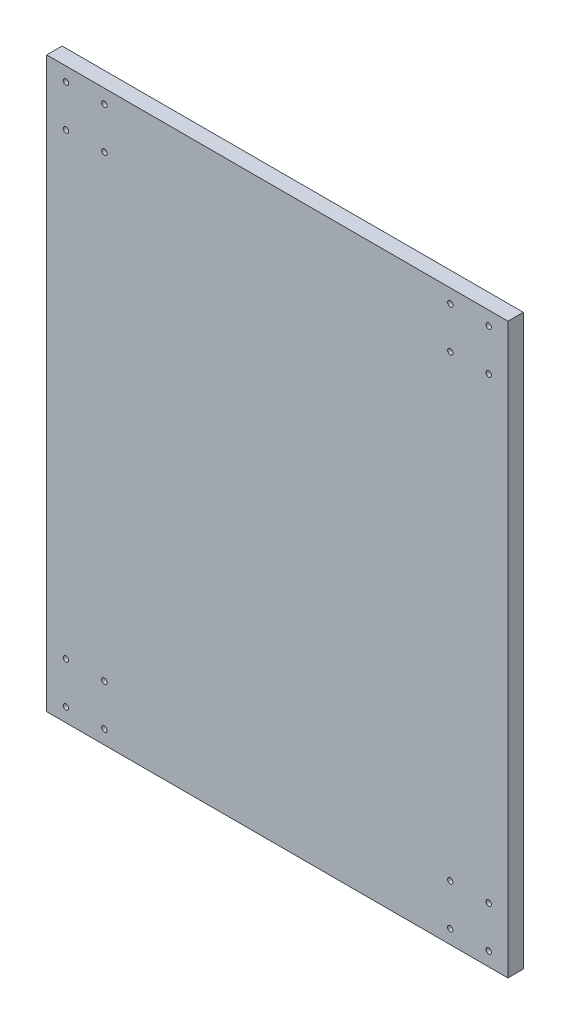
ISO-10303-21;
HEADER;
FILE_DESCRIPTION(('STEP AP214'),'2;1');
FILE_NAME('part.step','',(''),(''),'','','');
FILE_SCHEMA(('AUTOMOTIVE_DESIGN { 1 0 10303 214 1 1 1 1 }'));
ENDSEC;
DATA;
#1=APPLICATION_CONTEXT('core data for automotive mechanical design processes');
#2=APPLICATION_PROTOCOL_DEFINITION('international standard','automotive_design',2000,#1);
#3=PRODUCT_CONTEXT('',#1,'mechanical');
#4=PRODUCT('Part','Part','',(#3));
#5=PRODUCT_RELATED_PRODUCT_CATEGORY('part','',(#4));
#6=PRODUCT_DEFINITION_FORMATION('','',#4);
#7=PRODUCT_DEFINITION_CONTEXT('part definition',#1,'design');
#8=PRODUCT_DEFINITION('design','',#6,#7);
#9=PRODUCT_DEFINITION_SHAPE('','',#8);
#10=(LENGTH_UNIT() NAMED_UNIT(*) SI_UNIT(.MILLI.,.METRE.));
#11=(NAMED_UNIT(*) PLANE_ANGLE_UNIT() SI_UNIT($,.RADIAN.));
#12=(NAMED_UNIT(*) SI_UNIT($,.STERADIAN.) SOLID_ANGLE_UNIT());
#13=UNCERTAINTY_MEASURE_WITH_UNIT(LENGTH_MEASURE(1.E-05),#10,'distance_accuracy_value','');
#14=(GEOMETRIC_REPRESENTATION_CONTEXT(3) GLOBAL_UNCERTAINTY_ASSIGNED_CONTEXT((#13)) GLOBAL_UNIT_ASSIGNED_CONTEXT((#10,
#11,#12)) REPRESENTATION_CONTEXT('',''));
#15=CARTESIAN_POINT('',(0.,0.,0.));
#16=DIRECTION('',(0.,0.,1.));
#17=DIRECTION('',(1.,0.,0.));
#18=AXIS2_PLACEMENT_3D('',#15,#16,#17);
#19=CARTESIAN_POINT('',(300.,0.,20.));
#20=DIRECTION('',(1.,0.,0.));
#21=DIRECTION('',(0.,0.,-1.));
#22=AXIS2_PLACEMENT_3D('',#19,#20,#21);
#23=PLANE('',#22);
#24=DIRECTION('',(0.,-1.,0.));
#25=VECTOR('',#24,1.);
#26=CARTESIAN_POINT('',(300.,-8.32667268468867E-13,0.));
#27=LINE('',#26,#25);
#28=CARTESIAN_POINT('',(300.,370.,0.));
#29=VERTEX_POINT('',#28);
#30=CARTESIAN_POINT('',(300.,-370.,0.));
#31=VERTEX_POINT('',#30);
#32=EDGE_CURVE('E149',#29,#31,#27,.T.);
#33=ORIENTED_EDGE('',*,*,#32,.F.);
#34=DIRECTION('',(0.,0.,-1.));
#35=VECTOR('',#34,1.);
#36=CARTESIAN_POINT('',(300.,370.,20.));
#37=LINE('',#36,#35);
#38=CARTESIAN_POINT('',(300.,370.,20.));
#39=VERTEX_POINT('',#38);
#40=EDGE_CURVE('E11',#39,#29,#37,.T.);
#41=ORIENTED_EDGE('',*,*,#40,.F.);
#42=DIRECTION('',(0.,-1.,0.));
#43=VECTOR('',#42,1.);
#44=CARTESIAN_POINT('',(300.,0.,20.));
#45=LINE('',#44,#43);
#46=CARTESIAN_POINT('',(300.,-370.,20.));
#47=VERTEX_POINT('',#46);
#48=EDGE_CURVE('E94',#39,#47,#45,.T.);
#49=ORIENTED_EDGE('',*,*,#48,.T.);
#50=DIRECTION('',(0.,0.,-1.));
#51=VECTOR('',#50,1.);
#52=CARTESIAN_POINT('',(300.,-370.,20.));
#53=LINE('',#52,#51);
#54=EDGE_CURVE('E72',#47,#31,#53,.T.);
#55=ORIENTED_EDGE('',*,*,#54,.T.);
#56=EDGE_LOOP('',(#33,#41,#49,#55));
#57=FACE_BOUND('',#56,.T.);
#58=ADVANCED_FACE('F32',(#57),#23,.T.);
#59=CARTESIAN_POINT('',(0.,370.,20.));
#60=DIRECTION('',(0.,1.,0.));
#61=DIRECTION('',(-1.,0.,0.));
#62=AXIS2_PLACEMENT_3D('',#59,#60,#61);
#63=PLANE('',#62);
#64=DIRECTION('',(1.,0.,0.));
#65=VECTOR('',#64,1.);
#66=CARTESIAN_POINT('',(0.,370.,0.));
#67=LINE('',#66,#65);
#68=CARTESIAN_POINT('',(-300.,370.,0.));
#69=VERTEX_POINT('',#68);
#70=EDGE_CURVE('E84',#69,#29,#67,.T.);
#71=ORIENTED_EDGE('',*,*,#70,.F.);
#72=DIRECTION('',(0.,0.,-1.));
#73=VECTOR('',#72,1.);
#74=CARTESIAN_POINT('',(-300.,370.,20.));
#75=LINE('',#74,#73);
#76=CARTESIAN_POINT('',(-300.,370.,20.));
#77=VERTEX_POINT('',#76);
#78=EDGE_CURVE('E41',#77,#69,#75,.T.);
#79=ORIENTED_EDGE('',*,*,#78,.F.);
#80=DIRECTION('',(1.,0.,0.));
#81=VECTOR('',#80,1.);
#82=CARTESIAN_POINT('',(0.,370.,20.));
#83=LINE('',#82,#81);
#84=EDGE_CURVE('E82',#77,#39,#83,.T.);
#85=ORIENTED_EDGE('',*,*,#84,.T.);
#86=ORIENTED_EDGE('',*,*,#40,.T.);
#87=EDGE_LOOP('',(#71,#79,#85,#86));
#88=FACE_BOUND('',#87,.T.);
#89=ADVANCED_FACE('F80',(#88),#63,.T.);
#90=CARTESIAN_POINT('',(-300.,0.,20.));
#91=DIRECTION('',(1.,0.,0.));
#92=DIRECTION('',(0.,0.,-1.));
#93=AXIS2_PLACEMENT_3D('',#90,#91,#92);
#94=PLANE('',#93);
#95=DIRECTION('',(0.,-1.,0.));
#96=VECTOR('',#95,1.);
#97=CARTESIAN_POINT('',(-300.,0.,0.));
#98=LINE('',#97,#96);
#99=CARTESIAN_POINT('',(-300.,-370.,0.));
#100=VERTEX_POINT('',#99);
#101=EDGE_CURVE('E152',#69,#100,#98,.T.);
#102=ORIENTED_EDGE('',*,*,#101,.T.);
#103=DIRECTION('',(0.,0.,-1.));
#104=VECTOR('',#103,1.);
#105=CARTESIAN_POINT('',(-300.,-370.,20.));
#106=LINE('',#105,#104);
#107=CARTESIAN_POINT('',(-300.,-370.,20.));
#108=VERTEX_POINT('',#107);
#109=EDGE_CURVE('E87',#108,#100,#106,.T.);
#110=ORIENTED_EDGE('',*,*,#109,.F.);
#111=DIRECTION('',(0.,-1.,0.));
#112=VECTOR('',#111,1.);
#113=CARTESIAN_POINT('',(-300.,0.,20.));
#114=LINE('',#113,#112);
#115=EDGE_CURVE('E89',#77,#108,#114,.T.);
#116=ORIENTED_EDGE('',*,*,#115,.F.);
#117=ORIENTED_EDGE('',*,*,#78,.T.);
#118=EDGE_LOOP('',(#102,#110,#116,#117));
#119=FACE_BOUND('',#118,.T.);
#120=ADVANCED_FACE('F90',(#119),#94,.F.);
#121=CARTESIAN_POINT('',(-275.,-352.,20.));
#122=DIRECTION('',(0.,0.,-1.));
#123=DIRECTION('',(-1.,0.,0.));
#124=AXIS2_PLACEMENT_3D('',#121,#122,#123);
#125=CYLINDRICAL_SURFACE('',#124,3.50000000000002);
#126=CARTESIAN_POINT('',(-275.,-352.,20.));
#127=DIRECTION('',(0.,0.,1.));
#128=DIRECTION('',(1.,0.,0.));
#129=AXIS2_PLACEMENT_3D('',#126,#127,#128);
#130=CIRCLE('',#129,3.50000000000002);
#131=CARTESIAN_POINT('',(-271.5,-352.,20.));
#132=VERTEX_POINT('',#131);
#133=EDGE_CURVE('E107',#132,#132,#130,.F.);
#134=ORIENTED_EDGE('',*,*,#133,.F.);
#135=EDGE_LOOP('',(#134));
#136=FACE_BOUND('',#135,.T.);
#137=CARTESIAN_POINT('',(-275.,-352.,0.));
#138=DIRECTION('',(0.,0.,1.));
#139=DIRECTION('',(1.,0.,0.));
#140=AXIS2_PLACEMENT_3D('',#137,#138,#139);
#141=CIRCLE('',#140,3.50000000000002);
#142=CARTESIAN_POINT('',(-271.5,-352.,0.));
#143=VERTEX_POINT('',#142);
#144=EDGE_CURVE('E161',#143,#143,#141,.F.);
#145=ORIENTED_EDGE('',*,*,#144,.T.);
#146=EDGE_LOOP('',(#145));
#147=FACE_BOUND('',#146,.T.);
#148=ADVANCED_FACE('F276',(#136,#147),#125,.F.);
#149=CARTESIAN_POINT('',(275.,352.,20.));
#150=DIRECTION('',(0.,0.,-1.));
#151=DIRECTION('',(-1.,0.,0.));
#152=AXIS2_PLACEMENT_3D('',#149,#150,#151);
#153=CYLINDRICAL_SURFACE('',#152,3.50000000000002);
#154=CARTESIAN_POINT('',(275.,352.,20.));
#155=DIRECTION('',(0.,0.,1.));
#156=DIRECTION('',(1.,0.,0.));
#157=AXIS2_PLACEMENT_3D('',#154,#155,#156);
#158=CIRCLE('',#157,3.50000000000002);
#159=CARTESIAN_POINT('',(278.5,352.,20.));
#160=VERTEX_POINT('',#159);
#161=EDGE_CURVE('E104',#160,#160,#158,.F.);
#162=ORIENTED_EDGE('',*,*,#161,.F.);
#163=EDGE_LOOP('',(#162));
#164=FACE_BOUND('',#163,.T.);
#165=CARTESIAN_POINT('',(275.,352.,-4.16333634234434E-13));
#166=DIRECTION('',(0.,0.,1.));
#167=DIRECTION('',(1.,0.,0.));
#168=AXIS2_PLACEMENT_3D('',#165,#166,#167);
#169=CIRCLE('',#168,3.50000000000002);
#170=CARTESIAN_POINT('',(278.5,352.,-4.16333634234434E-13));
#171=VERTEX_POINT('',#170);
#172=EDGE_CURVE('E158',#171,#171,#169,.F.);
#173=ORIENTED_EDGE('',*,*,#172,.T.);
#174=EDGE_LOOP('',(#173));
#175=FACE_BOUND('',#174,.T.);
#176=ADVANCED_FACE('F279',(#164,#175),#153,.F.);
#177=CARTESIAN_POINT('',(-225.,352.,19.9999999999996));
#178=DIRECTION('',(0.,0.,-1.));
#179=DIRECTION('',(-1.,0.,0.));
#180=AXIS2_PLACEMENT_3D('',#177,#178,#179);
#181=CYLINDRICAL_SURFACE('',#180,3.49999999999999);
#182=CARTESIAN_POINT('',(-225.,352.,19.9999999999996));
#183=DIRECTION('',(0.,0.,1.));
#184=DIRECTION('',(1.,0.,0.));
#185=AXIS2_PLACEMENT_3D('',#182,#183,#184);
#186=CIRCLE('',#185,3.49999999999999);
#187=CARTESIAN_POINT('',(-221.5,352.,19.9999999999996));
#188=VERTEX_POINT('',#187);
#189=EDGE_CURVE('E101',#188,#188,#186,.F.);
#190=ORIENTED_EDGE('',*,*,#189,.F.);
#191=EDGE_LOOP('',(#190));
#192=FACE_BOUND('',#191,.T.);
#193=CARTESIAN_POINT('',(-225.,352.,-3.88578058618805E-13));
#194=DIRECTION('',(0.,0.,1.));
#195=DIRECTION('',(1.,0.,0.));
#196=AXIS2_PLACEMENT_3D('',#193,#194,#195);
#197=CIRCLE('',#196,3.49999999999999);
#198=CARTESIAN_POINT('',(-221.5,352.,-3.88578058618805E-13));
#199=VERTEX_POINT('',#198);
#200=EDGE_CURVE('E155',#199,#199,#197,.F.);
#201=ORIENTED_EDGE('',*,*,#200,.T.);
#202=EDGE_LOOP('',(#201));
#203=FACE_BOUND('',#202,.T.);
#204=ADVANCED_FACE('F283',(#192,#203),#181,.F.);
#205=CARTESIAN_POINT('',(0.,-370.,20.));
#206=DIRECTION('',(0.,1.,0.));
#207=DIRECTION('',(-1.,0.,0.));
#208=AXIS2_PLACEMENT_3D('',#205,#206,#207);
#209=PLANE('',#208);
#210=DIRECTION('',(1.,0.,0.));
#211=VECTOR('',#210,1.);
#212=CARTESIAN_POINT('',(0.,-370.,0.));
#213=LINE('',#212,#211);
#214=EDGE_CURVE('E65',#100,#31,#213,.T.);
#215=ORIENTED_EDGE('',*,*,#214,.T.);
#216=ORIENTED_EDGE('',*,*,#54,.F.);
#217=DIRECTION('',(1.,0.,0.));
#218=VECTOR('',#217,1.);
#219=CARTESIAN_POINT('',(0.,-370.,20.));
#220=LINE('',#219,#218);
#221=EDGE_CURVE('E49',#108,#47,#220,.T.);
#222=ORIENTED_EDGE('',*,*,#221,.F.);
#223=ORIENTED_EDGE('',*,*,#109,.T.);
#224=EDGE_LOOP('',(#215,#216,#222,#223));
#225=FACE_BOUND('',#224,.T.);
#226=ADVANCED_FACE('F170',(#225),#209,.F.);
#227=CARTESIAN_POINT('',(-275.,352.,19.9999999999996));
#228=DIRECTION('',(0.,0.,-1.));
#229=DIRECTION('',(-1.,0.,0.));
#230=AXIS2_PLACEMENT_3D('',#227,#228,#229);
#231=CYLINDRICAL_SURFACE('',#230,3.50000000000002);
#232=CARTESIAN_POINT('',(-275.,352.,19.9999999999996));
#233=DIRECTION('',(0.,0.,1.));
#234=DIRECTION('',(1.,0.,0.));
#235=AXIS2_PLACEMENT_3D('',#232,#233,#234);
#236=CIRCLE('',#235,3.50000000000002);
#237=CARTESIAN_POINT('',(-271.5,352.,19.9999999999996));
#238=VERTEX_POINT('',#237);
#239=EDGE_CURVE('E96',#238,#238,#236,.T.);
#240=ORIENTED_EDGE('',*,*,#239,.T.);
#241=EDGE_LOOP('',(#240));
#242=FACE_BOUND('',#241,.T.);
#243=CARTESIAN_POINT('',(-275.,352.,-4.16333634234434E-13));
#244=DIRECTION('',(0.,0.,1.));
#245=DIRECTION('',(1.,0.,0.));
#246=AXIS2_PLACEMENT_3D('',#243,#244,#245);
#247=CIRCLE('',#246,3.50000000000002);
#248=CARTESIAN_POINT('',(-271.5,352.,-4.16333634234434E-13));
#249=VERTEX_POINT('',#248);
#250=EDGE_CURVE('E146',#249,#249,#247,.T.);
#251=ORIENTED_EDGE('',*,*,#250,.F.);
#252=EDGE_LOOP('',(#251));
#253=FACE_BOUND('',#252,.T.);
#254=ADVANCED_FACE('F181',(#242,#253),#231,.F.);
#255=CARTESIAN_POINT('',(-275.,298.,20.));
#256=DIRECTION('',(0.,0.,-1.));
#257=DIRECTION('',(-1.,0.,0.));
#258=AXIS2_PLACEMENT_3D('',#255,#256,#257);
#259=CYLINDRICAL_SURFACE('',#258,3.50000000000002);
#260=CARTESIAN_POINT('',(-275.,298.,20.));
#261=DIRECTION('',(0.,0.,1.));
#262=DIRECTION('',(1.,0.,0.));
#263=AXIS2_PLACEMENT_3D('',#260,#261,#262);
#264=CIRCLE('',#263,3.50000000000002);
#265=CARTESIAN_POINT('',(-271.5,298.,20.));
#266=VERTEX_POINT('',#265);
#267=EDGE_CURVE('E437',#266,#266,#264,.T.);
#268=ORIENTED_EDGE('',*,*,#267,.T.);
#269=EDGE_LOOP('',(#268));
#270=FACE_BOUND('',#269,.T.);
#271=CARTESIAN_POINT('',(-275.,298.,-4.16333634234434E-13));
#272=DIRECTION('',(0.,0.,1.));
#273=DIRECTION('',(1.,0.,0.));
#274=AXIS2_PLACEMENT_3D('',#271,#272,#273);
#275=CIRCLE('',#274,3.50000000000002);
#276=CARTESIAN_POINT('',(-271.5,298.,-4.16333634234434E-13));
#277=VERTEX_POINT('',#276);
#278=EDGE_CURVE('E143',#277,#277,#275,.T.);
#279=ORIENTED_EDGE('',*,*,#278,.F.);
#280=EDGE_LOOP('',(#279));
#281=FACE_BOUND('',#280,.T.);
#282=ADVANCED_FACE('F184',(#270,#281),#259,.F.);
#283=CARTESIAN_POINT('',(-225.,298.,19.9999999999996));
#284=DIRECTION('',(0.,0.,-1.));
#285=DIRECTION('',(-1.,0.,0.));
#286=AXIS2_PLACEMENT_3D('',#283,#284,#285);
#287=CYLINDRICAL_SURFACE('',#286,3.49999999999999);
#288=CARTESIAN_POINT('',(-225.,298.,19.9999999999996));
#289=DIRECTION('',(0.,0.,1.));
#290=DIRECTION('',(1.,0.,0.));
#291=AXIS2_PLACEMENT_3D('',#288,#289,#290);
#292=CIRCLE('',#291,3.49999999999999);
#293=CARTESIAN_POINT('',(-221.5,298.,19.9999999999996));
#294=VERTEX_POINT('',#293);
#295=EDGE_CURVE('E433',#294,#294,#292,.F.);
#296=ORIENTED_EDGE('',*,*,#295,.F.);
#297=EDGE_LOOP('',(#296));
#298=FACE_BOUND('',#297,.T.);
#299=CARTESIAN_POINT('',(-225.,298.,-3.88578058618805E-13));
#300=DIRECTION('',(0.,0.,1.));
#301=DIRECTION('',(1.,0.,0.));
#302=AXIS2_PLACEMENT_3D('',#299,#300,#301);
#303=CIRCLE('',#302,3.49999999999999);
#304=CARTESIAN_POINT('',(-221.5,298.,-3.88578058618805E-13));
#305=VERTEX_POINT('',#304);
#306=EDGE_CURVE('E140',#305,#305,#303,.F.);
#307=ORIENTED_EDGE('',*,*,#306,.T.);
#308=EDGE_LOOP('',(#307));
#309=FACE_BOUND('',#308,.T.);
#310=ADVANCED_FACE('F188',(#298,#309),#287,.F.);
#311=CARTESIAN_POINT('',(225.,352.,20.));
#312=DIRECTION('',(0.,0.,-1.));
#313=DIRECTION('',(-1.,0.,0.));
#314=AXIS2_PLACEMENT_3D('',#311,#312,#313);
#315=CYLINDRICAL_SURFACE('',#314,3.49999999999999);
#316=CARTESIAN_POINT('',(225.,352.,20.));
#317=DIRECTION('',(0.,0.,1.));
#318=DIRECTION('',(1.,0.,0.));
#319=AXIS2_PLACEMENT_3D('',#316,#317,#318);
#320=CIRCLE('',#319,3.49999999999999);
#321=CARTESIAN_POINT('',(228.5,352.,20.));
#322=VERTEX_POINT('',#321);
#323=EDGE_CURVE('E429',#322,#322,#320,.T.);
#324=ORIENTED_EDGE('',*,*,#323,.T.);
#325=EDGE_LOOP('',(#324));
#326=FACE_BOUND('',#325,.T.);
#327=CARTESIAN_POINT('',(225.,352.,0.));
#328=DIRECTION('',(0.,0.,1.));
#329=DIRECTION('',(1.,0.,0.));
#330=AXIS2_PLACEMENT_3D('',#327,#328,#329);
#331=CIRCLE('',#330,3.49999999999999);
#332=CARTESIAN_POINT('',(228.5,352.,0.));
#333=VERTEX_POINT('',#332);
#334=EDGE_CURVE('E137',#333,#333,#331,.T.);
#335=ORIENTED_EDGE('',*,*,#334,.F.);
#336=EDGE_LOOP('',(#335));
#337=FACE_BOUND('',#336,.T.);
#338=ADVANCED_FACE('F192',(#326,#337),#315,.F.);
#339=CARTESIAN_POINT('',(225.,298.,20.));
#340=DIRECTION('',(0.,0.,-1.));
#341=DIRECTION('',(-1.,0.,0.));
#342=AXIS2_PLACEMENT_3D('',#339,#340,#341);
#343=CYLINDRICAL_SURFACE('',#342,3.49999999999999);
#344=CARTESIAN_POINT('',(225.,298.,20.));
#345=DIRECTION('',(0.,0.,1.));
#346=DIRECTION('',(1.,0.,0.));
#347=AXIS2_PLACEMENT_3D('',#344,#345,#346);
#348=CIRCLE('',#347,3.49999999999999);
#349=CARTESIAN_POINT('',(228.5,298.,20.));
#350=VERTEX_POINT('',#349);
#351=EDGE_CURVE('E425',#350,#350,#348,.T.);
#352=ORIENTED_EDGE('',*,*,#351,.T.);
#353=EDGE_LOOP('',(#352));
#354=FACE_BOUND('',#353,.T.);
#355=CARTESIAN_POINT('',(225.,298.,0.));
#356=DIRECTION('',(0.,0.,1.));
#357=DIRECTION('',(1.,0.,0.));
#358=AXIS2_PLACEMENT_3D('',#355,#356,#357);
#359=CIRCLE('',#358,3.49999999999999);
#360=CARTESIAN_POINT('',(228.5,298.,0.));
#361=VERTEX_POINT('',#360);
#362=EDGE_CURVE('E134',#361,#361,#359,.T.);
#363=ORIENTED_EDGE('',*,*,#362,.F.);
#364=EDGE_LOOP('',(#363));
#365=FACE_BOUND('',#364,.T.);
#366=ADVANCED_FACE('F196',(#354,#365),#343,.F.);
#367=CARTESIAN_POINT('',(275.,298.,20.));
#368=DIRECTION('',(0.,0.,-1.));
#369=DIRECTION('',(-1.,0.,0.));
#370=AXIS2_PLACEMENT_3D('',#367,#368,#369);
#371=CYLINDRICAL_SURFACE('',#370,3.50000000000002);
#372=CARTESIAN_POINT('',(275.,298.,20.));
#373=DIRECTION('',(0.,0.,1.));
#374=DIRECTION('',(1.,0.,0.));
#375=AXIS2_PLACEMENT_3D('',#372,#373,#374);
#376=CIRCLE('',#375,3.50000000000002);
#377=CARTESIAN_POINT('',(278.5,298.,20.));
#378=VERTEX_POINT('',#377);
#379=EDGE_CURVE('E421',#378,#378,#376,.F.);
#380=ORIENTED_EDGE('',*,*,#379,.F.);
#381=EDGE_LOOP('',(#380));
#382=FACE_BOUND('',#381,.T.);
#383=CARTESIAN_POINT('',(275.,298.,0.));
#384=DIRECTION('',(0.,0.,1.));
#385=DIRECTION('',(1.,0.,0.));
#386=AXIS2_PLACEMENT_3D('',#383,#384,#385);
#387=CIRCLE('',#386,3.50000000000002);
#388=CARTESIAN_POINT('',(278.5,298.,0.));
#389=VERTEX_POINT('',#388);
#390=EDGE_CURVE('E131',#389,#389,#387,.F.);
#391=ORIENTED_EDGE('',*,*,#390,.T.);
#392=EDGE_LOOP('',(#391));
#393=FACE_BOUND('',#392,.T.);
#394=ADVANCED_FACE('F200',(#382,#393),#371,.F.);
#395=CARTESIAN_POINT('',(-275.,-298.,19.9999999999996));
#396=DIRECTION('',(0.,0.,-1.));
#397=DIRECTION('',(-1.,0.,0.));
#398=AXIS2_PLACEMENT_3D('',#395,#396,#397);
#399=CYLINDRICAL_SURFACE('',#398,3.50000000000002);
#400=CARTESIAN_POINT('',(-275.,-298.,19.9999999999996));
#401=DIRECTION('',(0.,0.,1.));
#402=DIRECTION('',(1.,0.,0.));
#403=AXIS2_PLACEMENT_3D('',#400,#401,#402);
#404=CIRCLE('',#403,3.50000000000002);
#405=CARTESIAN_POINT('',(-271.5,-298.,19.9999999999996));
#406=VERTEX_POINT('',#405);
#407=EDGE_CURVE('E417',#406,#406,#404,.F.);
#408=ORIENTED_EDGE('',*,*,#407,.F.);
#409=EDGE_LOOP('',(#408));
#410=FACE_BOUND('',#409,.T.);
#411=CARTESIAN_POINT('',(-275.,-298.,-4.16333634234434E-13));
#412=DIRECTION('',(0.,0.,1.));
#413=DIRECTION('',(1.,0.,0.));
#414=AXIS2_PLACEMENT_3D('',#411,#412,#413);
#415=CIRCLE('',#414,3.50000000000002);
#416=CARTESIAN_POINT('',(-271.5,-298.,-4.16333634234434E-13));
#417=VERTEX_POINT('',#416);
#418=EDGE_CURVE('E128',#417,#417,#415,.F.);
#419=ORIENTED_EDGE('',*,*,#418,.T.);
#420=EDGE_LOOP('',(#419));
#421=FACE_BOUND('',#420,.T.);
#422=ADVANCED_FACE('F204',(#410,#421),#399,.F.);
#423=CARTESIAN_POINT('',(-225.,-352.,19.9999999999996));
#424=DIRECTION('',(0.,0.,-1.));
#425=DIRECTION('',(-1.,0.,0.));
#426=AXIS2_PLACEMENT_3D('',#423,#424,#425);
#427=CYLINDRICAL_SURFACE('',#426,3.49999999999999);
#428=CARTESIAN_POINT('',(-225.,-352.,19.9999999999996));
#429=DIRECTION('',(0.,0.,1.));
#430=DIRECTION('',(1.,0.,0.));
#431=AXIS2_PLACEMENT_3D('',#428,#429,#430);
#432=CIRCLE('',#431,3.49999999999999);
#433=CARTESIAN_POINT('',(-221.5,-352.,19.9999999999996));
#434=VERTEX_POINT('',#433);
#435=EDGE_CURVE('E413',#434,#434,#432,.T.);
#436=ORIENTED_EDGE('',*,*,#435,.T.);
#437=EDGE_LOOP('',(#436));
#438=FACE_BOUND('',#437,.T.);
#439=CARTESIAN_POINT('',(-225.,-352.,-3.88578058618805E-13));
#440=DIRECTION('',(0.,0.,1.));
#441=DIRECTION('',(1.,0.,0.));
#442=AXIS2_PLACEMENT_3D('',#439,#440,#441);
#443=CIRCLE('',#442,3.49999999999999);
#444=CARTESIAN_POINT('',(-221.5,-352.,-3.88578058618805E-13));
#445=VERTEX_POINT('',#444);
#446=EDGE_CURVE('E125',#445,#445,#443,.T.);
#447=ORIENTED_EDGE('',*,*,#446,.F.);
#448=EDGE_LOOP('',(#447));
#449=FACE_BOUND('',#448,.T.);
#450=ADVANCED_FACE('F208',(#438,#449),#427,.F.);
#451=CARTESIAN_POINT('',(-225.,-298.,19.9999999999996));
#452=DIRECTION('',(0.,0.,-1.));
#453=DIRECTION('',(-1.,0.,0.));
#454=AXIS2_PLACEMENT_3D('',#451,#452,#453);
#455=CYLINDRICAL_SURFACE('',#454,3.49999999999999);
#456=CARTESIAN_POINT('',(-225.,-298.,19.9999999999996));
#457=DIRECTION('',(0.,0.,1.));
#458=DIRECTION('',(1.,0.,0.));
#459=AXIS2_PLACEMENT_3D('',#456,#457,#458);
#460=CIRCLE('',#459,3.49999999999999);
#461=CARTESIAN_POINT('',(-221.5,-298.,19.9999999999996));
#462=VERTEX_POINT('',#461);
#463=EDGE_CURVE('E409',#462,#462,#460,.T.);
#464=ORIENTED_EDGE('',*,*,#463,.T.);
#465=EDGE_LOOP('',(#464));
#466=FACE_BOUND('',#465,.T.);
#467=CARTESIAN_POINT('',(-225.,-298.,-3.88578058618805E-13));
#468=DIRECTION('',(0.,0.,1.));
#469=DIRECTION('',(1.,0.,0.));
#470=AXIS2_PLACEMENT_3D('',#467,#468,#469);
#471=CIRCLE('',#470,3.49999999999999);
#472=CARTESIAN_POINT('',(-221.5,-298.,-3.88578058618805E-13));
#473=VERTEX_POINT('',#472);
#474=EDGE_CURVE('E122',#473,#473,#471,.T.);
#475=ORIENTED_EDGE('',*,*,#474,.F.);
#476=EDGE_LOOP('',(#475));
#477=FACE_BOUND('',#476,.T.);
#478=ADVANCED_FACE('F212',(#466,#477),#455,.F.);
#479=CARTESIAN_POINT('',(225.,-298.,20.));
#480=DIRECTION('',(0.,0.,-1.));
#481=DIRECTION('',(-1.,0.,0.));
#482=AXIS2_PLACEMENT_3D('',#479,#480,#481);
#483=CYLINDRICAL_SURFACE('',#482,3.49999999999999);
#484=CARTESIAN_POINT('',(225.,-298.,20.));
#485=DIRECTION('',(0.,0.,1.));
#486=DIRECTION('',(1.,0.,0.));
#487=AXIS2_PLACEMENT_3D('',#484,#485,#486);
#488=CIRCLE('',#487,3.49999999999999);
#489=CARTESIAN_POINT('',(228.5,-298.,20.));
#490=VERTEX_POINT('',#489);
#491=EDGE_CURVE('E405',#490,#490,#488,.F.);
#492=ORIENTED_EDGE('',*,*,#491,.F.);
#493=EDGE_LOOP('',(#492));
#494=FACE_BOUND('',#493,.T.);
#495=CARTESIAN_POINT('',(225.,-298.,0.));
#496=DIRECTION('',(0.,0.,1.));
#497=DIRECTION('',(1.,0.,0.));
#498=AXIS2_PLACEMENT_3D('',#495,#496,#497);
#499=CIRCLE('',#498,3.49999999999999);
#500=CARTESIAN_POINT('',(228.5,-298.,0.));
#501=VERTEX_POINT('',#500);
#502=EDGE_CURVE('E119',#501,#501,#499,.F.);
#503=ORIENTED_EDGE('',*,*,#502,.T.);
#504=EDGE_LOOP('',(#503));
#505=FACE_BOUND('',#504,.T.);
#506=ADVANCED_FACE('F216',(#494,#505),#483,.F.);
#507=CARTESIAN_POINT('',(275.,-352.,20.));
#508=DIRECTION('',(0.,0.,-1.));
#509=DIRECTION('',(-1.,0.,0.));
#510=AXIS2_PLACEMENT_3D('',#507,#508,#509);
#511=CYLINDRICAL_SURFACE('',#510,3.50000000000002);
#512=CARTESIAN_POINT('',(275.,-352.,20.));
#513=DIRECTION('',(0.,0.,1.));
#514=DIRECTION('',(1.,0.,0.));
#515=AXIS2_PLACEMENT_3D('',#512,#513,#514);
#516=CIRCLE('',#515,3.50000000000002);
#517=CARTESIAN_POINT('',(278.5,-352.,20.));
#518=VERTEX_POINT('',#517);
#519=EDGE_CURVE('E231',#518,#518,#516,.T.);
#520=ORIENTED_EDGE('',*,*,#519,.T.);
#521=EDGE_LOOP('',(#520));
#522=FACE_BOUND('',#521,.T.);
#523=CARTESIAN_POINT('',(275.,-352.,0.));
#524=DIRECTION('',(0.,0.,1.));
#525=DIRECTION('',(1.,0.,0.));
#526=AXIS2_PLACEMENT_3D('',#523,#524,#525);
#527=CIRCLE('',#526,3.50000000000002);
#528=CARTESIAN_POINT('',(278.5,-352.,0.));
#529=VERTEX_POINT('',#528);
#530=EDGE_CURVE('E116',#529,#529,#527,.T.);
#531=ORIENTED_EDGE('',*,*,#530,.F.);
#532=EDGE_LOOP('',(#531));
#533=FACE_BOUND('',#532,.T.);
#534=ADVANCED_FACE('F219',(#522,#533),#511,.F.);
#535=CARTESIAN_POINT('',(275.,-298.,20.));
#536=DIRECTION('',(0.,0.,-1.));
#537=DIRECTION('',(-1.,0.,0.));
#538=AXIS2_PLACEMENT_3D('',#535,#536,#537);
#539=CYLINDRICAL_SURFACE('',#538,3.50000000000002);
#540=CARTESIAN_POINT('',(275.,-298.,20.));
#541=DIRECTION('',(0.,0.,1.));
#542=DIRECTION('',(1.,0.,0.));
#543=AXIS2_PLACEMENT_3D('',#540,#541,#542);
#544=CIRCLE('',#543,3.50000000000002);
#545=CARTESIAN_POINT('',(278.5,-298.,20.));
#546=VERTEX_POINT('',#545);
#547=EDGE_CURVE('E167',#546,#546,#544,.T.);
#548=ORIENTED_EDGE('',*,*,#547,.T.);
#549=EDGE_LOOP('',(#548));
#550=FACE_BOUND('',#549,.T.);
#551=CARTESIAN_POINT('',(275.,-298.,0.));
#552=DIRECTION('',(0.,0.,1.));
#553=DIRECTION('',(1.,0.,0.));
#554=AXIS2_PLACEMENT_3D('',#551,#552,#553);
#555=CIRCLE('',#554,3.50000000000002);
#556=CARTESIAN_POINT('',(278.5,-298.,0.));
#557=VERTEX_POINT('',#556);
#558=EDGE_CURVE('E113',#557,#557,#555,.T.);
#559=ORIENTED_EDGE('',*,*,#558,.F.);
#560=EDGE_LOOP('',(#559));
#561=FACE_BOUND('',#560,.T.);
#562=ADVANCED_FACE('F34',(#550,#561),#539,.F.);
#563=CARTESIAN_POINT('',(225.,-352.,20.));
#564=DIRECTION('',(0.,0.,-1.));
#565=DIRECTION('',(-1.,0.,0.));
#566=AXIS2_PLACEMENT_3D('',#563,#564,#565);
#567=CYLINDRICAL_SURFACE('',#566,3.49999999999999);
#568=CARTESIAN_POINT('',(225.,-352.,20.));
#569=DIRECTION('',(0.,0.,1.));
#570=DIRECTION('',(1.,0.,0.));
#571=AXIS2_PLACEMENT_3D('',#568,#569,#570);
#572=CIRCLE('',#571,3.49999999999999);
#573=CARTESIAN_POINT('',(228.5,-352.,20.));
#574=VERTEX_POINT('',#573);
#575=EDGE_CURVE('E110',#574,#574,#572,.F.);
#576=ORIENTED_EDGE('',*,*,#575,.F.);
#577=EDGE_LOOP('',(#576));
#578=FACE_BOUND('',#577,.T.);
#579=CARTESIAN_POINT('',(225.,-352.,0.));
#580=DIRECTION('',(0.,0.,1.));
#581=DIRECTION('',(1.,0.,0.));
#582=AXIS2_PLACEMENT_3D('',#579,#580,#581);
#583=CIRCLE('',#582,3.49999999999999);
#584=CARTESIAN_POINT('',(228.5,-352.,0.));
#585=VERTEX_POINT('',#584);
#586=EDGE_CURVE('E164',#585,#585,#583,.F.);
#587=ORIENTED_EDGE('',*,*,#586,.T.);
#588=EDGE_LOOP('',(#587));
#589=FACE_BOUND('',#588,.T.);
#590=ADVANCED_FACE('F226',(#578,#589),#567,.F.);
#591=CARTESIAN_POINT('',(0.,-8.32667268468867E-13,20.));
#592=DIRECTION('',(0.,0.,1.));
#593=DIRECTION('',(1.,0.,0.));
#594=AXIS2_PLACEMENT_3D('',#591,#592,#593);
#595=PLANE('',#594);
#596=ORIENTED_EDGE('',*,*,#547,.F.);
#597=EDGE_LOOP('',(#596));
#598=FACE_BOUND('',#597,.T.);
#599=ORIENTED_EDGE('',*,*,#519,.F.);
#600=EDGE_LOOP('',(#599));
#601=FACE_BOUND('',#600,.T.);
#602=ORIENTED_EDGE('',*,*,#491,.T.);
#603=EDGE_LOOP('',(#602));
#604=FACE_BOUND('',#603,.T.);
#605=ORIENTED_EDGE('',*,*,#463,.F.);
#606=EDGE_LOOP('',(#605));
#607=FACE_BOUND('',#606,.T.);
#608=ORIENTED_EDGE('',*,*,#435,.F.);
#609=EDGE_LOOP('',(#608));
#610=FACE_BOUND('',#609,.T.);
#611=ORIENTED_EDGE('',*,*,#407,.T.);
#612=EDGE_LOOP('',(#611));
#613=FACE_BOUND('',#612,.T.);
#614=ORIENTED_EDGE('',*,*,#379,.T.);
#615=EDGE_LOOP('',(#614));
#616=FACE_BOUND('',#615,.T.);
#617=ORIENTED_EDGE('',*,*,#351,.F.);
#618=EDGE_LOOP('',(#617));
#619=FACE_BOUND('',#618,.T.);
#620=ORIENTED_EDGE('',*,*,#323,.F.);
#621=EDGE_LOOP('',(#620));
#622=FACE_BOUND('',#621,.T.);
#623=ORIENTED_EDGE('',*,*,#295,.T.);
#624=EDGE_LOOP('',(#623));
#625=FACE_BOUND('',#624,.T.);
#626=ORIENTED_EDGE('',*,*,#267,.F.);
#627=EDGE_LOOP('',(#626));
#628=FACE_BOUND('',#627,.T.);
#629=ORIENTED_EDGE('',*,*,#239,.F.);
#630=EDGE_LOOP('',(#629));
#631=FACE_BOUND('',#630,.T.);
#632=ORIENTED_EDGE('',*,*,#48,.F.);
#633=ORIENTED_EDGE('',*,*,#84,.F.);
#634=ORIENTED_EDGE('',*,*,#115,.T.);
#635=ORIENTED_EDGE('',*,*,#221,.T.);
#636=EDGE_LOOP('',(#632,#633,#634,#635));
#637=FACE_BOUND('',#636,.T.);
#638=ORIENTED_EDGE('',*,*,#189,.T.);
#639=EDGE_LOOP('',(#638));
#640=FACE_BOUND('',#639,.T.);
#641=ORIENTED_EDGE('',*,*,#161,.T.);
#642=EDGE_LOOP('',(#641));
#643=FACE_BOUND('',#642,.T.);
#644=ORIENTED_EDGE('',*,*,#133,.T.);
#645=EDGE_LOOP('',(#644));
#646=FACE_BOUND('',#645,.T.);
#647=ORIENTED_EDGE('',*,*,#575,.T.);
#648=EDGE_LOOP('',(#647));
#649=FACE_BOUND('',#648,.T.);
#650=ADVANCED_FACE('F92',(#598,#601,#604,#607,#610,#613,#616,#619,#622,#625,#628,#631,#637,#640,
#643,#646,#649),#595,.T.);
#651=CARTESIAN_POINT('',(0.,0.,0.));
#652=DIRECTION('',(0.,0.,1.));
#653=DIRECTION('',(1.,0.,0.));
#654=AXIS2_PLACEMENT_3D('',#651,#652,#653);
#655=PLANE('',#654);
#656=ORIENTED_EDGE('',*,*,#558,.T.);
#657=EDGE_LOOP('',(#656));
#658=FACE_BOUND('',#657,.T.);
#659=ORIENTED_EDGE('',*,*,#530,.T.);
#660=EDGE_LOOP('',(#659));
#661=FACE_BOUND('',#660,.T.);
#662=ORIENTED_EDGE('',*,*,#502,.F.);
#663=EDGE_LOOP('',(#662));
#664=FACE_BOUND('',#663,.T.);
#665=ORIENTED_EDGE('',*,*,#474,.T.);
#666=EDGE_LOOP('',(#665));
#667=FACE_BOUND('',#666,.T.);
#668=ORIENTED_EDGE('',*,*,#446,.T.);
#669=EDGE_LOOP('',(#668));
#670=FACE_BOUND('',#669,.T.);
#671=ORIENTED_EDGE('',*,*,#418,.F.);
#672=EDGE_LOOP('',(#671));
#673=FACE_BOUND('',#672,.T.);
#674=ORIENTED_EDGE('',*,*,#390,.F.);
#675=EDGE_LOOP('',(#674));
#676=FACE_BOUND('',#675,.T.);
#677=ORIENTED_EDGE('',*,*,#362,.T.);
#678=EDGE_LOOP('',(#677));
#679=FACE_BOUND('',#678,.T.);
#680=ORIENTED_EDGE('',*,*,#334,.T.);
#681=EDGE_LOOP('',(#680));
#682=FACE_BOUND('',#681,.T.);
#683=ORIENTED_EDGE('',*,*,#306,.F.);
#684=EDGE_LOOP('',(#683));
#685=FACE_BOUND('',#684,.T.);
#686=ORIENTED_EDGE('',*,*,#278,.T.);
#687=EDGE_LOOP('',(#686));
#688=FACE_BOUND('',#687,.T.);
#689=ORIENTED_EDGE('',*,*,#250,.T.);
#690=EDGE_LOOP('',(#689));
#691=FACE_BOUND('',#690,.T.);
#692=ORIENTED_EDGE('',*,*,#32,.T.);
#693=ORIENTED_EDGE('',*,*,#214,.F.);
#694=ORIENTED_EDGE('',*,*,#101,.F.);
#695=ORIENTED_EDGE('',*,*,#70,.T.);
#696=EDGE_LOOP('',(#692,#693,#694,#695));
#697=FACE_BOUND('',#696,.T.);
#698=ORIENTED_EDGE('',*,*,#200,.F.);
#699=EDGE_LOOP('',(#698));
#700=FACE_BOUND('',#699,.T.);
#701=ORIENTED_EDGE('',*,*,#172,.F.);
#702=EDGE_LOOP('',(#701));
#703=FACE_BOUND('',#702,.T.);
#704=ORIENTED_EDGE('',*,*,#144,.F.);
#705=EDGE_LOOP('',(#704));
#706=FACE_BOUND('',#705,.T.);
#707=ORIENTED_EDGE('',*,*,#586,.F.);
#708=EDGE_LOOP('',(#707));
#709=FACE_BOUND('',#708,.T.);
#710=ADVANCED_FACE('F171',(#658,#661,#664,#667,#670,#673,#676,#679,#682,#685,#688,#691,#697,
#700,#703,#706,#709),#655,.F.);
#711=CLOSED_SHELL('',(#58,#89,#120,#148,#176,#204,#226,#254,#282,#310,#338,#366,#394,#422,#450,
#478,#506,#534,#562,#590,#650,#710));
#712=MANIFOLD_SOLID_BREP('B2',#711);
#713=ADVANCED_BREP_SHAPE_REPRESENTATION('',(#18,#712),#14);
#714=SHAPE_DEFINITION_REPRESENTATION(#9,#713);
ENDSEC;
END-ISO-10303-21;
